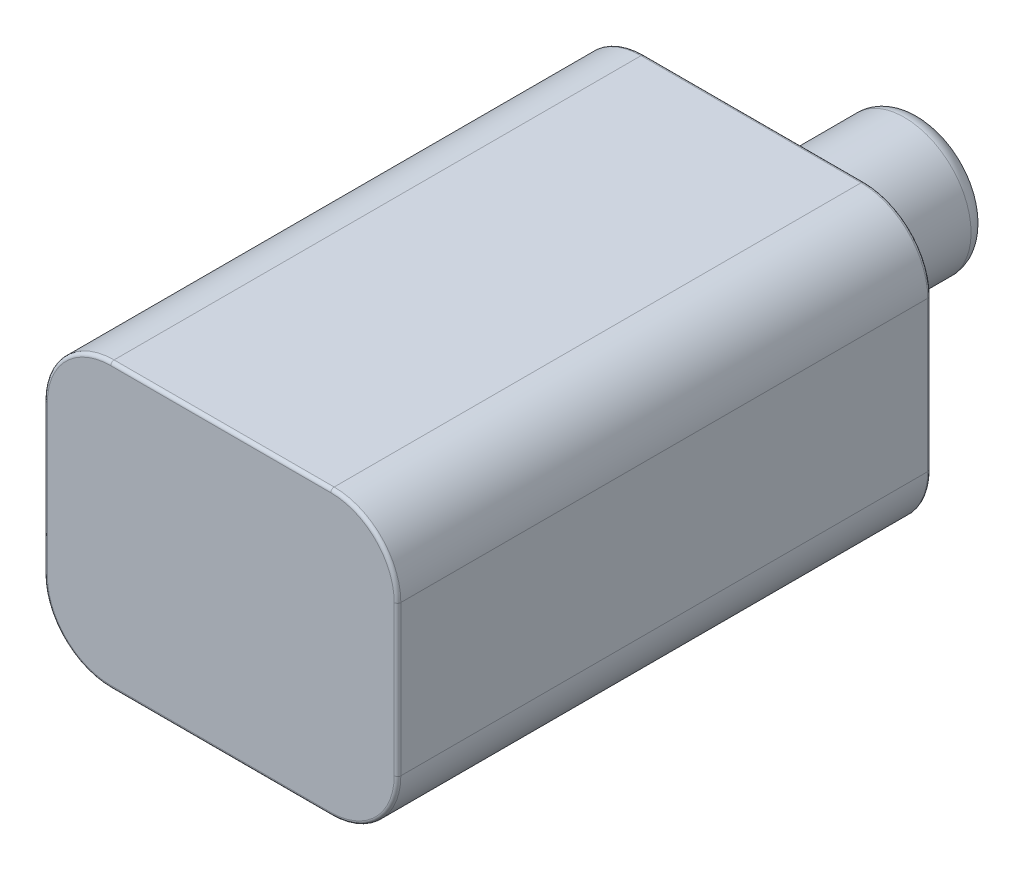
ISO-10303-21;
HEADER;
FILE_DESCRIPTION(('STEP AP214'),'2;1');
FILE_NAME('part.step','',(''),(''),'','','');
FILE_SCHEMA(('AUTOMOTIVE_DESIGN { 1 0 10303 214 1 1 1 1 }'));
ENDSEC;
DATA;
#1=APPLICATION_CONTEXT('core data for automotive mechanical design processes');
#2=APPLICATION_PROTOCOL_DEFINITION('international standard','automotive_design',2000,#1);
#3=PRODUCT_CONTEXT('',#1,'mechanical');
#4=PRODUCT('Part','Part','',(#3));
#5=PRODUCT_RELATED_PRODUCT_CATEGORY('part','',(#4));
#6=PRODUCT_DEFINITION_FORMATION('','',#4);
#7=PRODUCT_DEFINITION_CONTEXT('part definition',#1,'design');
#8=PRODUCT_DEFINITION('design','',#6,#7);
#9=PRODUCT_DEFINITION_SHAPE('','',#8);
#10=(LENGTH_UNIT() NAMED_UNIT(*) SI_UNIT(.MILLI.,.METRE.));
#11=(NAMED_UNIT(*) PLANE_ANGLE_UNIT() SI_UNIT($,.RADIAN.));
#12=(NAMED_UNIT(*) SI_UNIT($,.STERADIAN.) SOLID_ANGLE_UNIT());
#13=UNCERTAINTY_MEASURE_WITH_UNIT(LENGTH_MEASURE(1.E-05),#10,'distance_accuracy_value','');
#14=(GEOMETRIC_REPRESENTATION_CONTEXT(3) GLOBAL_UNCERTAINTY_ASSIGNED_CONTEXT((#13)) GLOBAL_UNIT_ASSIGNED_CONTEXT((#10,
#11,#12)) REPRESENTATION_CONTEXT('',''));
#15=CARTESIAN_POINT('',(0.,0.,0.));
#16=DIRECTION('',(0.,0.,1.));
#17=DIRECTION('',(1.,0.,0.));
#18=AXIS2_PLACEMENT_3D('',#15,#16,#17);
#19=CARTESIAN_POINT('',(0.,0.,-5.));
#20=DIRECTION('',(0.,0.,-1.));
#21=DIRECTION('',(-1.,0.,0.));
#22=AXIS2_PLACEMENT_3D('',#19,#20,#21);
#23=PLANE('',#22);
#24=CARTESIAN_POINT('',(0.,0.,-5.));
#25=DIRECTION('',(0.,0.,1.));
#26=DIRECTION('',(1.,0.,0.));
#27=AXIS2_PLACEMENT_3D('',#24,#25,#26);
#28=CIRCLE('',#27,1.5);
#29=CARTESIAN_POINT('',(1.5,0.,-5.));
#30=VERTEX_POINT('',#29);
#31=CARTESIAN_POINT('',(-1.5,0.,-5.));
#32=VERTEX_POINT('',#31);
#33=EDGE_CURVE('E142',#30,#32,#28,.T.);
#34=ORIENTED_EDGE('',*,*,#33,.F.);
#35=CARTESIAN_POINT('',(0.,0.,-5.));
#36=DIRECTION('',(0.,0.,1.));
#37=DIRECTION('',(-1.,0.,0.));
#38=AXIS2_PLACEMENT_3D('',#35,#36,#37);
#39=CIRCLE('',#38,1.5);
#40=EDGE_CURVE('E140',#32,#30,#39,.T.);
#41=ORIENTED_EDGE('',*,*,#40,.F.);
#42=EDGE_LOOP('',(#34,#41));
#43=FACE_BOUND('',#42,.T.);
#44=ADVANCED_FACE('F17',(#43),#23,.T.);
#45=CARTESIAN_POINT('',(0.,0.,-4.5));
#46=DIRECTION('',(0.,0.,-1.));
#47=DIRECTION('',(-1.,0.,0.));
#48=AXIS2_PLACEMENT_3D('',#45,#46,#47);
#49=TOROIDAL_SURFACE('',#48,1.5,0.5);
#50=ORIENTED_EDGE('',*,*,#40,.T.);
#51=ORIENTED_EDGE('',*,*,#33,.T.);
#52=EDGE_LOOP('',(#50,#51));
#53=FACE_BOUND('',#52,.T.);
#54=CARTESIAN_POINT('',(0.,0.,-4.5));
#55=DIRECTION('',(0.,0.,1.));
#56=DIRECTION('',(1.,0.,0.));
#57=AXIS2_PLACEMENT_3D('',#54,#55,#56);
#58=CIRCLE('',#57,2.);
#59=CARTESIAN_POINT('',(2.,0.,-4.5));
#60=VERTEX_POINT('',#59);
#61=EDGE_CURVE('E148',#60,#60,#58,.T.);
#62=ORIENTED_EDGE('',*,*,#61,.F.);
#63=EDGE_LOOP('',(#62));
#64=FACE_BOUND('',#63,.T.);
#65=ADVANCED_FACE('F144',(#53,#64),#49,.T.);
#66=CARTESIAN_POINT('',(0.,0.,-5.));
#67=DIRECTION('',(0.,0.,1.));
#68=DIRECTION('',(1.,0.,0.));
#69=AXIS2_PLACEMENT_3D('',#66,#67,#68);
#70=CYLINDRICAL_SURFACE('',#69,2.);
#71=CARTESIAN_POINT('',(0.,0.,-0.1));
#72=DIRECTION('',(0.,0.,-1.));
#73=DIRECTION('',(-1.,0.,0.));
#74=AXIS2_PLACEMENT_3D('',#71,#72,#73);
#75=CIRCLE('',#74,2.);
#76=CARTESIAN_POINT('',(-2.,0.,-0.1));
#77=VERTEX_POINT('',#76);
#78=EDGE_CURVE('E303',#77,#77,#75,.T.);
#79=ORIENTED_EDGE('',*,*,#78,.T.);
#80=EDGE_LOOP('',(#79));
#81=FACE_BOUND('',#80,.T.);
#82=ORIENTED_EDGE('',*,*,#61,.T.);
#83=EDGE_LOOP('',(#82));
#84=FACE_BOUND('',#83,.T.);
#85=ADVANCED_FACE('F174',(#81,#84),#70,.T.);
#86=CARTESIAN_POINT('',(-3.3,4.25,16.));
#87=DIRECTION('',(0.,-1.,0.));
#88=DIRECTION('',(0.,0.,-1.));
#89=AXIS2_PLACEMENT_3D('',#86,#87,#88);
#90=PLANE('',#89);
#91=DIRECTION('',(-1.,0.,0.));
#92=VECTOR('',#91,1.);
#93=CARTESIAN_POINT('',(-3.3,4.25,15.9));
#94=LINE('',#93,#92);
#95=CARTESIAN_POINT('',(3.3,4.25,15.9));
#96=VERTEX_POINT('',#95);
#97=CARTESIAN_POINT('',(-3.3,4.25,15.9));
#98=VERTEX_POINT('',#97);
#99=EDGE_CURVE('E262',#96,#98,#94,.T.);
#100=ORIENTED_EDGE('',*,*,#99,.F.);
#101=DIRECTION('',(0.,0.,-1.));
#102=VECTOR('',#101,1.);
#103=CARTESIAN_POINT('',(3.3,4.25,16.));
#104=LINE('',#103,#102);
#105=CARTESIAN_POINT('',(3.3,4.25,0.0999999999999994));
#106=VERTEX_POINT('',#105);
#107=EDGE_CURVE('E225',#106,#96,#104,.F.);
#108=ORIENTED_EDGE('',*,*,#107,.F.);
#109=DIRECTION('',(1.,0.,0.));
#110=VECTOR('',#109,1.);
#111=CARTESIAN_POINT('',(-3.3,4.25,0.0999999999999994));
#112=LINE('',#111,#110);
#113=CARTESIAN_POINT('',(-3.3,4.25,0.0999999999999994));
#114=VERTEX_POINT('',#113);
#115=EDGE_CURVE('E300',#114,#106,#112,.T.);
#116=ORIENTED_EDGE('',*,*,#115,.F.);
#117=DIRECTION('',(0.,0.,-1.));
#118=VECTOR('',#117,1.);
#119=CARTESIAN_POINT('',(-3.3,4.25,16.));
#120=LINE('',#119,#118);
#121=EDGE_CURVE('E278',#98,#114,#120,.T.);
#122=ORIENTED_EDGE('',*,*,#121,.F.);
#123=EDGE_LOOP('',(#100,#108,#116,#122));
#124=FACE_BOUND('',#123,.T.);
#125=ADVANCED_FACE('F204',(#124),#90,.F.);
#126=CARTESIAN_POINT('',(0.,0.,-0.1));
#127=DIRECTION('',(0.,0.,-1.));
#128=DIRECTION('',(-1.,0.,0.));
#129=AXIS2_PLACEMENT_3D('',#126,#127,#128);
#130=TOROIDAL_SURFACE('',#129,2.1,0.1);
#131=ORIENTED_EDGE('',*,*,#78,.F.);
#132=EDGE_LOOP('',(#131));
#133=FACE_BOUND('',#132,.T.);
#134=CARTESIAN_POINT('',(0.,0.,0.));
#135=DIRECTION('',(0.,0.,-1.));
#136=DIRECTION('',(1.,0.,0.));
#137=AXIS2_PLACEMENT_3D('',#134,#135,#136);
#138=CIRCLE('',#137,2.1);
#139=CARTESIAN_POINT('',(-2.1,0.,0.));
#140=VERTEX_POINT('',#139);
#141=CARTESIAN_POINT('',(2.1,0.,0.));
#142=VERTEX_POINT('',#141);
#143=EDGE_CURVE('E189',#140,#142,#138,.F.);
#144=ORIENTED_EDGE('',*,*,#143,.F.);
#145=CARTESIAN_POINT('',(0.,0.,0.));
#146=DIRECTION('',(0.,0.,-1.));
#147=DIRECTION('',(-1.,0.,0.));
#148=AXIS2_PLACEMENT_3D('',#145,#146,#147);
#149=CIRCLE('',#148,2.1);
#150=EDGE_CURVE('E214',#142,#140,#149,.F.);
#151=ORIENTED_EDGE('',*,*,#150,.F.);
#152=EDGE_LOOP('',(#144,#151));
#153=FACE_BOUND('',#152,.T.);
#154=ADVANCED_FACE('F193',(#133,#153),#130,.F.);
#155=CARTESIAN_POINT('',(-3.3,4.15,0.0999999999999994));
#156=DIRECTION('',(1.,0.,0.));
#157=DIRECTION('',(0.,0.,-1.));
#158=AXIS2_PLACEMENT_3D('',#155,#156,#157);
#159=CYLINDRICAL_SURFACE('',#158,0.1);
#160=CARTESIAN_POINT('',(3.3,4.15,0.0999999999999994));
#161=DIRECTION('',(1.,0.,0.));
#162=DIRECTION('',(0.,1.,0.));
#163=AXIS2_PLACEMENT_3D('',#160,#161,#162);
#164=CIRCLE('',#163,0.1);
#165=CARTESIAN_POINT('',(3.3,4.15,0.));
#166=VERTEX_POINT('',#165);
#167=EDGE_CURVE('E302',#166,#106,#164,.T.);
#168=ORIENTED_EDGE('',*,*,#167,.F.);
#169=DIRECTION('',(-1.,0.,0.));
#170=VECTOR('',#169,1.);
#171=CARTESIAN_POINT('',(-3.3,4.15,0.));
#172=LINE('',#171,#170);
#173=CARTESIAN_POINT('',(-3.3,4.15,0.));
#174=VERTEX_POINT('',#173);
#175=EDGE_CURVE('E631',#174,#166,#172,.F.);
#176=ORIENTED_EDGE('',*,*,#175,.F.);
#177=CARTESIAN_POINT('',(-3.3,4.15,0.0999999999999994));
#178=DIRECTION('',(1.,0.,0.));
#179=DIRECTION('',(0.,1.,0.));
#180=AXIS2_PLACEMENT_3D('',#177,#178,#179);
#181=CIRCLE('',#180,0.1);
#182=EDGE_CURVE('E638',#114,#174,#181,.F.);
#183=ORIENTED_EDGE('',*,*,#182,.F.);
#184=ORIENTED_EDGE('',*,*,#115,.T.);
#185=EDGE_LOOP('',(#168,#176,#183,#184));
#186=FACE_BOUND('',#185,.T.);
#187=ADVANCED_FACE('F203',(#186),#159,.T.);
#188=CARTESIAN_POINT('',(3.3,2.25,0.0999999999999994));
#189=DIRECTION('',(0.,0.,-1.));
#190=DIRECTION('',(-1.,0.,0.));
#191=AXIS2_PLACEMENT_3D('',#188,#189,#190);
#192=TOROIDAL_SURFACE('',#191,1.9,0.1);
#193=ORIENTED_EDGE('',*,*,#167,.T.);
#194=CARTESIAN_POINT('',(3.3,2.25,0.0999999999999994));
#195=DIRECTION('',(0.,0.,-1.));
#196=DIRECTION('',(-1.,0.,0.));
#197=AXIS2_PLACEMENT_3D('',#194,#195,#196);
#198=CIRCLE('',#197,2.);
#199=CARTESIAN_POINT('',(5.3,2.25,0.0999999999999994));
#200=VERTEX_POINT('',#199);
#201=EDGE_CURVE('E250',#200,#106,#198,.F.);
#202=ORIENTED_EDGE('',*,*,#201,.F.);
#203=CARTESIAN_POINT('',(5.2,2.25,0.0999999999999994));
#204=DIRECTION('',(0.,-1.,0.));
#205=DIRECTION('',(0.,0.,-1.));
#206=AXIS2_PLACEMENT_3D('',#203,#204,#205);
#207=CIRCLE('',#206,0.1);
#208=CARTESIAN_POINT('',(5.2,2.25,0.));
#209=VERTEX_POINT('',#208);
#210=EDGE_CURVE('E478',#209,#200,#207,.T.);
#211=ORIENTED_EDGE('',*,*,#210,.F.);
#212=CARTESIAN_POINT('',(3.3,2.25,0.));
#213=DIRECTION('',(0.,0.,1.));
#214=DIRECTION('',(1.,0.,0.));
#215=AXIS2_PLACEMENT_3D('',#212,#213,#214);
#216=CIRCLE('',#215,1.9);
#217=EDGE_CURVE('E580',#166,#209,#216,.F.);
#218=ORIENTED_EDGE('',*,*,#217,.F.);
#219=EDGE_LOOP('',(#193,#202,#211,#218));
#220=FACE_BOUND('',#219,.T.);
#221=ADVANCED_FACE('F640',(#220),#192,.T.);
#222=CARTESIAN_POINT('',(-3.3,2.25,0.0999999999999994));
#223=DIRECTION('',(0.,0.,-1.));
#224=DIRECTION('',(-1.,0.,0.));
#225=AXIS2_PLACEMENT_3D('',#222,#223,#224);
#226=TOROIDAL_SURFACE('',#225,1.9,0.1);
#227=ORIENTED_EDGE('',*,*,#182,.T.);
#228=CARTESIAN_POINT('',(-3.3,2.25,0.));
#229=DIRECTION('',(0.,0.,1.));
#230=DIRECTION('',(0.,1.,0.));
#231=AXIS2_PLACEMENT_3D('',#228,#229,#230);
#232=CIRCLE('',#231,1.9);
#233=CARTESIAN_POINT('',(-5.2,2.25,0.));
#234=VERTEX_POINT('',#233);
#235=EDGE_CURVE('E614',#234,#174,#232,.F.);
#236=ORIENTED_EDGE('',*,*,#235,.F.);
#237=CARTESIAN_POINT('',(-5.2,2.25,0.0999999999999994));
#238=DIRECTION('',(0.,1.,0.));
#239=DIRECTION('',(0.,0.,1.));
#240=AXIS2_PLACEMENT_3D('',#237,#238,#239);
#241=CIRCLE('',#240,0.1);
#242=CARTESIAN_POINT('',(-5.3,2.25,0.0999999999999994));
#243=VERTEX_POINT('',#242);
#244=EDGE_CURVE('E282',#243,#234,#241,.F.);
#245=ORIENTED_EDGE('',*,*,#244,.F.);
#246=CARTESIAN_POINT('',(-3.3,2.25,0.0999999999999994));
#247=DIRECTION('',(0.,0.,-1.));
#248=DIRECTION('',(-1.,0.,0.));
#249=AXIS2_PLACEMENT_3D('',#246,#247,#248);
#250=CIRCLE('',#249,2.);
#251=EDGE_CURVE('E281',#114,#243,#250,.F.);
#252=ORIENTED_EDGE('',*,*,#251,.F.);
#253=EDGE_LOOP('',(#227,#236,#245,#252));
#254=FACE_BOUND('',#253,.T.);
#255=ADVANCED_FACE('F656',(#254),#226,.T.);
#256=CARTESIAN_POINT('',(-5.2,-2.25,0.0999999999999994));
#257=DIRECTION('',(0.,1.,0.));
#258=DIRECTION('',(0.,0.,1.));
#259=AXIS2_PLACEMENT_3D('',#256,#257,#258);
#260=CYLINDRICAL_SURFACE('',#259,0.1);
#261=ORIENTED_EDGE('',*,*,#244,.T.);
#262=DIRECTION('',(0.,1.,0.));
#263=VECTOR('',#262,1.);
#264=CARTESIAN_POINT('',(-5.2,-2.25,0.));
#265=LINE('',#264,#263);
#266=CARTESIAN_POINT('',(-5.2,-2.25,0.));
#267=VERTEX_POINT('',#266);
#268=EDGE_CURVE('E619',#267,#234,#265,.T.);
#269=ORIENTED_EDGE('',*,*,#268,.F.);
#270=CARTESIAN_POINT('',(-5.2,-2.25,0.0999999999999994));
#271=DIRECTION('',(0.,1.,0.));
#272=DIRECTION('',(0.,0.,1.));
#273=AXIS2_PLACEMENT_3D('',#270,#271,#272);
#274=CIRCLE('',#273,0.1);
#275=CARTESIAN_POINT('',(-5.3,-2.25,0.0999999999999994));
#276=VERTEX_POINT('',#275);
#277=EDGE_CURVE('E679',#267,#276,#274,.T.);
#278=ORIENTED_EDGE('',*,*,#277,.T.);
#279=DIRECTION('',(0.,1.,0.));
#280=VECTOR('',#279,1.);
#281=CARTESIAN_POINT('',(-5.3,-2.25,0.0999999999999994));
#282=LINE('',#281,#280);
#283=EDGE_CURVE('E289',#276,#243,#282,.T.);
#284=ORIENTED_EDGE('',*,*,#283,.T.);
#285=EDGE_LOOP('',(#261,#269,#278,#284));
#286=FACE_BOUND('',#285,.T.);
#287=ADVANCED_FACE('F661',(#286),#260,.T.);
#288=CARTESIAN_POINT('',(-3.3,2.25,16.));
#289=DIRECTION('',(0.,0.,-1.));
#290=DIRECTION('',(-1.,0.,0.));
#291=AXIS2_PLACEMENT_3D('',#288,#289,#290);
#292=CYLINDRICAL_SURFACE('',#291,2.);
#293=ORIENTED_EDGE('',*,*,#121,.T.);
#294=ORIENTED_EDGE('',*,*,#251,.T.);
#295=DIRECTION('',(0.,0.,-1.));
#296=VECTOR('',#295,1.);
#297=CARTESIAN_POINT('',(-5.3,2.25,16.));
#298=LINE('',#297,#296);
#299=CARTESIAN_POINT('',(-5.3,2.25,15.9));
#300=VERTEX_POINT('',#299);
#301=EDGE_CURVE('E285',#243,#300,#298,.F.);
#302=ORIENTED_EDGE('',*,*,#301,.T.);
#303=CARTESIAN_POINT('',(-3.3,2.25,15.9));
#304=DIRECTION('',(0.,0.,-1.));
#305=DIRECTION('',(-1.,0.,0.));
#306=AXIS2_PLACEMENT_3D('',#303,#304,#305);
#307=CIRCLE('',#306,2.);
#308=EDGE_CURVE('E273',#98,#300,#307,.F.);
#309=ORIENTED_EDGE('',*,*,#308,.F.);
#310=EDGE_LOOP('',(#293,#294,#302,#309));
#311=FACE_BOUND('',#310,.T.);
#312=ADVANCED_FACE('F770',(#311),#292,.T.);
#313=CARTESIAN_POINT('',(-5.2,-2.25,15.9));
#314=DIRECTION('',(0.,-1.,0.));
#315=DIRECTION('',(0.,0.,-1.));
#316=AXIS2_PLACEMENT_3D('',#313,#314,#315);
#317=CYLINDRICAL_SURFACE('',#316,0.0999999999999994);
#318=CARTESIAN_POINT('',(-5.2,-2.25,15.9));
#319=DIRECTION('',(0.,1.,0.));
#320=DIRECTION('',(-1.,0.,0.));
#321=AXIS2_PLACEMENT_3D('',#318,#319,#320);
#322=CIRCLE('',#321,0.1);
#323=CARTESIAN_POINT('',(-5.2,-2.25,16.));
#324=VERTEX_POINT('',#323);
#325=CARTESIAN_POINT('',(-5.3,-2.25,15.9));
#326=VERTEX_POINT('',#325);
#327=EDGE_CURVE('E739',#324,#326,#322,.F.);
#328=ORIENTED_EDGE('',*,*,#327,.F.);
#329=DIRECTION('',(0.,1.,0.));
#330=VECTOR('',#329,1.);
#331=CARTESIAN_POINT('',(-5.2,-2.25,16.));
#332=LINE('',#331,#330);
#333=CARTESIAN_POINT('',(-5.2,2.25,16.));
#334=VERTEX_POINT('',#333);
#335=EDGE_CURVE('E717',#324,#334,#332,.T.);
#336=ORIENTED_EDGE('',*,*,#335,.T.);
#337=CARTESIAN_POINT('',(-5.2,2.25,15.9));
#338=DIRECTION('',(0.,1.,0.));
#339=DIRECTION('',(-1.,0.,0.));
#340=AXIS2_PLACEMENT_3D('',#337,#338,#339);
#341=CIRCLE('',#340,0.1);
#342=EDGE_CURVE('E275',#300,#334,#341,.T.);
#343=ORIENTED_EDGE('',*,*,#342,.F.);
#344=DIRECTION('',(0.,1.,0.));
#345=VECTOR('',#344,1.);
#346=CARTESIAN_POINT('',(-5.3,-2.25,15.9));
#347=LINE('',#346,#345);
#348=EDGE_CURVE('E288',#300,#326,#347,.F.);
#349=ORIENTED_EDGE('',*,*,#348,.T.);
#350=EDGE_LOOP('',(#328,#336,#343,#349));
#351=FACE_BOUND('',#350,.T.);
#352=ADVANCED_FACE('F518',(#351),#317,.T.);
#353=CARTESIAN_POINT('',(-3.3,2.25,15.9));
#354=DIRECTION('',(0.,0.,-1.));
#355=DIRECTION('',(-1.,0.,0.));
#356=AXIS2_PLACEMENT_3D('',#353,#354,#355);
#357=TOROIDAL_SURFACE('',#356,1.9,0.1);
#358=CARTESIAN_POINT('',(-3.3,4.15,15.9));
#359=DIRECTION('',(-1.,0.,0.));
#360=DIRECTION('',(0.,0.,1.));
#361=AXIS2_PLACEMENT_3D('',#358,#359,#360);
#362=CIRCLE('',#361,0.0999999999999994);
#363=CARTESIAN_POINT('',(-3.3,4.15,16.));
#364=VERTEX_POINT('',#363);
#365=EDGE_CURVE('E266',#98,#364,#362,.F.);
#366=ORIENTED_EDGE('',*,*,#365,.F.);
#367=ORIENTED_EDGE('',*,*,#308,.T.);
#368=ORIENTED_EDGE('',*,*,#342,.T.);
#369=CARTESIAN_POINT('',(-3.3,2.25,16.));
#370=DIRECTION('',(0.,0.,-1.));
#371=DIRECTION('',(-1.,0.,0.));
#372=AXIS2_PLACEMENT_3D('',#369,#370,#371);
#373=CIRCLE('',#372,1.9);
#374=EDGE_CURVE('E720',#334,#364,#373,.T.);
#375=ORIENTED_EDGE('',*,*,#374,.T.);
#376=EDGE_LOOP('',(#366,#367,#368,#375));
#377=FACE_BOUND('',#376,.T.);
#378=ADVANCED_FACE('F514',(#377),#357,.T.);
#379=CARTESIAN_POINT('',(-3.3,4.15,15.9));
#380=DIRECTION('',(-1.,0.,0.));
#381=DIRECTION('',(0.,0.,1.));
#382=AXIS2_PLACEMENT_3D('',#379,#380,#381);
#383=CYLINDRICAL_SURFACE('',#382,0.0999999999999994);
#384=CARTESIAN_POINT('',(3.3,4.15,15.9));
#385=DIRECTION('',(1.,0.,0.));
#386=DIRECTION('',(0.,1.,0.));
#387=AXIS2_PLACEMENT_3D('',#384,#385,#386);
#388=CIRCLE('',#387,0.1);
#389=CARTESIAN_POINT('',(3.3,4.15,16.));
#390=VERTEX_POINT('',#389);
#391=EDGE_CURVE('E265',#96,#390,#388,.T.);
#392=ORIENTED_EDGE('',*,*,#391,.F.);
#393=ORIENTED_EDGE('',*,*,#99,.T.);
#394=ORIENTED_EDGE('',*,*,#365,.T.);
#395=DIRECTION('',(-1.,0.,0.));
#396=VECTOR('',#395,1.);
#397=CARTESIAN_POINT('',(-3.3,4.15,16.));
#398=LINE('',#397,#396);
#399=EDGE_CURVE('E723',#364,#390,#398,.F.);
#400=ORIENTED_EDGE('',*,*,#399,.T.);
#401=EDGE_LOOP('',(#392,#393,#394,#400));
#402=FACE_BOUND('',#401,.T.);
#403=ADVANCED_FACE('F491',(#402),#383,.T.);
#404=CARTESIAN_POINT('',(3.3,2.25,15.9));
#405=DIRECTION('',(0.,0.,-1.));
#406=DIRECTION('',(-1.,0.,0.));
#407=AXIS2_PLACEMENT_3D('',#404,#405,#406);
#408=TOROIDAL_SURFACE('',#407,1.9,0.1);
#409=CARTESIAN_POINT('',(5.2,2.25,15.9));
#410=DIRECTION('',(0.,1.,0.));
#411=DIRECTION('',(0.,0.,1.));
#412=AXIS2_PLACEMENT_3D('',#409,#410,#411);
#413=CIRCLE('',#412,0.0999999999999994);
#414=CARTESIAN_POINT('',(5.3,2.25,15.9));
#415=VERTEX_POINT('',#414);
#416=CARTESIAN_POINT('',(5.2,2.25,16.));
#417=VERTEX_POINT('',#416);
#418=EDGE_CURVE('E253',#415,#417,#413,.F.);
#419=ORIENTED_EDGE('',*,*,#418,.F.);
#420=CARTESIAN_POINT('',(3.3,2.25,15.9));
#421=DIRECTION('',(0.,0.,-1.));
#422=DIRECTION('',(-1.,0.,0.));
#423=AXIS2_PLACEMENT_3D('',#420,#421,#422);
#424=CIRCLE('',#423,2.);
#425=EDGE_CURVE('E218',#96,#415,#424,.T.);
#426=ORIENTED_EDGE('',*,*,#425,.F.);
#427=ORIENTED_EDGE('',*,*,#391,.T.);
#428=CARTESIAN_POINT('',(3.3,2.25,16.));
#429=DIRECTION('',(0.,0.,-1.));
#430=DIRECTION('',(0.,1.,0.));
#431=AXIS2_PLACEMENT_3D('',#428,#429,#430);
#432=CIRCLE('',#431,1.9);
#433=EDGE_CURVE('E403',#390,#417,#432,.T.);
#434=ORIENTED_EDGE('',*,*,#433,.T.);
#435=EDGE_LOOP('',(#419,#426,#427,#434));
#436=FACE_BOUND('',#435,.T.);
#437=ADVANCED_FACE('F485',(#436),#408,.T.);
#438=CARTESIAN_POINT('',(5.2,-2.25,0.0999999999999994));
#439=DIRECTION('',(0.,-1.,0.));
#440=DIRECTION('',(0.,0.,-1.));
#441=AXIS2_PLACEMENT_3D('',#438,#439,#440);
#442=CYLINDRICAL_SURFACE('',#441,0.1);
#443=ORIENTED_EDGE('',*,*,#210,.T.);
#444=DIRECTION('',(0.,1.,0.));
#445=VECTOR('',#444,1.);
#446=CARTESIAN_POINT('',(5.3,-2.25,0.0999999999999994));
#447=LINE('',#446,#445);
#448=CARTESIAN_POINT('',(5.3,-2.25,0.0999999999999994));
#449=VERTEX_POINT('',#448);
#450=EDGE_CURVE('E237',#200,#449,#447,.F.);
#451=ORIENTED_EDGE('',*,*,#450,.T.);
#452=CARTESIAN_POINT('',(5.2,-2.25,0.0999999999999994));
#453=DIRECTION('',(0.,-1.,0.));
#454=DIRECTION('',(0.,0.,-1.));
#455=AXIS2_PLACEMENT_3D('',#452,#453,#454);
#456=CIRCLE('',#455,0.1);
#457=CARTESIAN_POINT('',(5.2,-2.25,0.));
#458=VERTEX_POINT('',#457);
#459=EDGE_CURVE('E504',#449,#458,#456,.F.);
#460=ORIENTED_EDGE('',*,*,#459,.T.);
#461=DIRECTION('',(0.,1.,0.));
#462=VECTOR('',#461,1.);
#463=CARTESIAN_POINT('',(5.2,-2.25,0.));
#464=LINE('',#463,#462);
#465=EDGE_CURVE('E626',#209,#458,#464,.F.);
#466=ORIENTED_EDGE('',*,*,#465,.F.);
#467=EDGE_LOOP('',(#443,#451,#460,#466));
#468=FACE_BOUND('',#467,.T.);
#469=ADVANCED_FACE('F490',(#468),#442,.T.);
#470=CARTESIAN_POINT('',(5.2,-2.25,15.9));
#471=DIRECTION('',(0.,1.,0.));
#472=DIRECTION('',(0.,0.,1.));
#473=AXIS2_PLACEMENT_3D('',#470,#471,#472);
#474=CYLINDRICAL_SURFACE('',#473,0.0999999999999994);
#475=ORIENTED_EDGE('',*,*,#418,.T.);
#476=DIRECTION('',(0.,1.,0.));
#477=VECTOR('',#476,1.);
#478=CARTESIAN_POINT('',(5.2,-2.25,16.));
#479=LINE('',#478,#477);
#480=CARTESIAN_POINT('',(5.2,-2.25,16.));
#481=VERTEX_POINT('',#480);
#482=EDGE_CURVE('E247',#417,#481,#479,.F.);
#483=ORIENTED_EDGE('',*,*,#482,.T.);
#484=CARTESIAN_POINT('',(5.2,-2.25,15.9));
#485=DIRECTION('',(0.,1.,0.));
#486=DIRECTION('',(0.,0.,1.));
#487=AXIS2_PLACEMENT_3D('',#484,#485,#486);
#488=CIRCLE('',#487,0.0999999999999994);
#489=CARTESIAN_POINT('',(5.3,-2.25,15.9));
#490=VERTEX_POINT('',#489);
#491=EDGE_CURVE('E474',#481,#490,#488,.T.);
#492=ORIENTED_EDGE('',*,*,#491,.T.);
#493=DIRECTION('',(0.,1.,0.));
#494=VECTOR('',#493,1.);
#495=CARTESIAN_POINT('',(5.3,-2.25,15.9));
#496=LINE('',#495,#494);
#497=EDGE_CURVE('E232',#490,#415,#496,.T.);
#498=ORIENTED_EDGE('',*,*,#497,.T.);
#499=EDGE_LOOP('',(#475,#483,#492,#498));
#500=FACE_BOUND('',#499,.T.);
#501=ADVANCED_FACE('F776',(#500),#474,.T.);
#502=CARTESIAN_POINT('',(3.3,2.25,16.));
#503=DIRECTION('',(0.,0.,-1.));
#504=DIRECTION('',(-1.,0.,0.));
#505=AXIS2_PLACEMENT_3D('',#502,#503,#504);
#506=CYLINDRICAL_SURFACE('',#505,2.);
#507=ORIENTED_EDGE('',*,*,#107,.T.);
#508=ORIENTED_EDGE('',*,*,#425,.T.);
#509=DIRECTION('',(0.,0.,1.));
#510=VECTOR('',#509,1.);
#511=CARTESIAN_POINT('',(5.3,2.25,16.));
#512=LINE('',#511,#510);
#513=EDGE_CURVE('E228',#415,#200,#512,.F.);
#514=ORIENTED_EDGE('',*,*,#513,.T.);
#515=ORIENTED_EDGE('',*,*,#201,.T.);
#516=EDGE_LOOP('',(#507,#508,#514,#515));
#517=FACE_BOUND('',#516,.T.);
#518=ADVANCED_FACE('F773',(#517),#506,.T.);
#519=CARTESIAN_POINT('',(-3.3,-2.25,0.));
#520=DIRECTION('',(0.,0.,-1.));
#521=DIRECTION('',(-1.,0.,0.));
#522=AXIS2_PLACEMENT_3D('',#519,#520,#521);
#523=PLANE('',#522);
#524=ORIENTED_EDGE('',*,*,#268,.T.);
#525=ORIENTED_EDGE('',*,*,#235,.T.);
#526=ORIENTED_EDGE('',*,*,#175,.T.);
#527=ORIENTED_EDGE('',*,*,#217,.T.);
#528=ORIENTED_EDGE('',*,*,#465,.T.);
#529=CARTESIAN_POINT('',(3.3,-2.25,0.));
#530=DIRECTION('',(0.,0.,1.));
#531=DIRECTION('',(0.,-1.,0.));
#532=AXIS2_PLACEMENT_3D('',#529,#530,#531);
#533=CIRCLE('',#532,1.9);
#534=CARTESIAN_POINT('',(3.3,-4.15,0.));
#535=VERTEX_POINT('',#534);
#536=EDGE_CURVE('E417',#535,#458,#533,.T.);
#537=ORIENTED_EDGE('',*,*,#536,.F.);
#538=DIRECTION('',(-1.,0.,0.));
#539=VECTOR('',#538,1.);
#540=CARTESIAN_POINT('',(-3.3,-4.15,0.));
#541=LINE('',#540,#539);
#542=CARTESIAN_POINT('',(-3.3,-4.15,0.));
#543=VERTEX_POINT('',#542);
#544=EDGE_CURVE('E424',#543,#535,#541,.F.);
#545=ORIENTED_EDGE('',*,*,#544,.F.);
#546=CARTESIAN_POINT('',(-3.3,-2.25,0.));
#547=DIRECTION('',(0.,0.,1.));
#548=DIRECTION('',(-1.,0.,0.));
#549=AXIS2_PLACEMENT_3D('',#546,#547,#548);
#550=CIRCLE('',#549,1.9);
#551=EDGE_CURVE('E602',#267,#543,#550,.T.);
#552=ORIENTED_EDGE('',*,*,#551,.F.);
#553=EDGE_LOOP('',(#524,#525,#526,#527,#528,#537,#545,#552));
#554=FACE_BOUND('',#553,.T.);
#555=ORIENTED_EDGE('',*,*,#143,.T.);
#556=ORIENTED_EDGE('',*,*,#150,.T.);
#557=EDGE_LOOP('',(#555,#556));
#558=FACE_BOUND('',#557,.T.);
#559=ADVANCED_FACE('F550',(#554,#558),#523,.T.);
#560=CARTESIAN_POINT('',(-3.3,-2.25,15.9));
#561=DIRECTION('',(0.,0.,-1.));
#562=DIRECTION('',(-1.,0.,0.));
#563=AXIS2_PLACEMENT_3D('',#560,#561,#562);
#564=TOROIDAL_SURFACE('',#563,1.9,0.1);
#565=CARTESIAN_POINT('',(-3.3,-4.15,15.9));
#566=DIRECTION('',(-1.,0.,0.));
#567=DIRECTION('',(0.,-1.,0.));
#568=AXIS2_PLACEMENT_3D('',#565,#566,#567);
#569=CIRCLE('',#568,0.1);
#570=CARTESIAN_POINT('',(-3.3,-4.25,15.9));
#571=VERTEX_POINT('',#570);
#572=CARTESIAN_POINT('',(-3.3,-4.15,16.));
#573=VERTEX_POINT('',#572);
#574=EDGE_CURVE('E297',#571,#573,#569,.T.);
#575=ORIENTED_EDGE('',*,*,#574,.T.);
#576=CARTESIAN_POINT('',(-3.3,-2.25,16.));
#577=DIRECTION('',(0.,0.,-1.));
#578=DIRECTION('',(0.,-1.,0.));
#579=AXIS2_PLACEMENT_3D('',#576,#577,#578);
#580=CIRCLE('',#579,1.9);
#581=EDGE_CURVE('E360',#573,#324,#580,.T.);
#582=ORIENTED_EDGE('',*,*,#581,.T.);
#583=ORIENTED_EDGE('',*,*,#327,.T.);
#584=CARTESIAN_POINT('',(-3.3,-2.25,15.9));
#585=DIRECTION('',(0.,0.,-1.));
#586=DIRECTION('',(-1.,0.,0.));
#587=AXIS2_PLACEMENT_3D('',#584,#585,#586);
#588=CIRCLE('',#587,2.);
#589=EDGE_CURVE('E441',#571,#326,#588,.T.);
#590=ORIENTED_EDGE('',*,*,#589,.F.);
#591=EDGE_LOOP('',(#575,#582,#583,#590));
#592=FACE_BOUND('',#591,.T.);
#593=ADVANCED_FACE('F539',(#592),#564,.T.);
#594=CARTESIAN_POINT('',(-5.3,-2.25,16.));
#595=DIRECTION('',(1.,0.,0.));
#596=DIRECTION('',(0.,0.,-1.));
#597=AXIS2_PLACEMENT_3D('',#594,#595,#596);
#598=PLANE('',#597);
#599=ORIENTED_EDGE('',*,*,#348,.F.);
#600=ORIENTED_EDGE('',*,*,#301,.F.);
#601=ORIENTED_EDGE('',*,*,#283,.F.);
#602=DIRECTION('',(0.,0.,-1.));
#603=VECTOR('',#602,1.);
#604=CARTESIAN_POINT('',(-5.3,-2.25,16.));
#605=LINE('',#604,#603);
#606=EDGE_CURVE('E447',#326,#276,#605,.T.);
#607=ORIENTED_EDGE('',*,*,#606,.F.);
#608=EDGE_LOOP('',(#599,#600,#601,#607));
#609=FACE_BOUND('',#608,.T.);
#610=ADVANCED_FACE('F549',(#609),#598,.F.);
#611=CARTESIAN_POINT('',(-3.3,-2.25,0.0999999999999994));
#612=DIRECTION('',(0.,0.,-1.));
#613=DIRECTION('',(-1.,0.,0.));
#614=AXIS2_PLACEMENT_3D('',#611,#612,#613);
#615=TOROIDAL_SURFACE('',#614,1.9,0.1);
#616=CARTESIAN_POINT('',(-3.3,-4.15,0.0999999999999994));
#617=DIRECTION('',(-1.,0.,0.));
#618=DIRECTION('',(0.,0.,1.));
#619=AXIS2_PLACEMENT_3D('',#616,#617,#618);
#620=CIRCLE('',#619,0.1);
#621=CARTESIAN_POINT('',(-3.3,-4.25,0.0999999999999994));
#622=VERTEX_POINT('',#621);
#623=EDGE_CURVE('E419',#622,#543,#620,.F.);
#624=ORIENTED_EDGE('',*,*,#623,.F.);
#625=CARTESIAN_POINT('',(-3.3,-2.25,0.0999999999999994));
#626=DIRECTION('',(0.,0.,-1.));
#627=DIRECTION('',(-1.,0.,0.));
#628=AXIS2_PLACEMENT_3D('',#625,#626,#627);
#629=CIRCLE('',#628,2.);
#630=EDGE_CURVE('E444',#276,#622,#629,.F.);
#631=ORIENTED_EDGE('',*,*,#630,.F.);
#632=ORIENTED_EDGE('',*,*,#277,.F.);
#633=ORIENTED_EDGE('',*,*,#551,.T.);
#634=EDGE_LOOP('',(#624,#631,#632,#633));
#635=FACE_BOUND('',#634,.T.);
#636=ADVANCED_FACE('F378',(#635),#615,.T.);
#637=CARTESIAN_POINT('',(-3.3,-2.25,16.));
#638=DIRECTION('',(0.,0.,-1.));
#639=DIRECTION('',(-1.,0.,0.));
#640=AXIS2_PLACEMENT_3D('',#637,#638,#639);
#641=PLANE('',#640);
#642=ORIENTED_EDGE('',*,*,#482,.F.);
#643=ORIENTED_EDGE('',*,*,#433,.F.);
#644=ORIENTED_EDGE('',*,*,#399,.F.);
#645=ORIENTED_EDGE('',*,*,#374,.F.);
#646=ORIENTED_EDGE('',*,*,#335,.F.);
#647=ORIENTED_EDGE('',*,*,#581,.F.);
#648=DIRECTION('',(1.,0.,0.));
#649=VECTOR('',#648,1.);
#650=CARTESIAN_POINT('',(-3.3,-4.15,16.));
#651=LINE('',#650,#649);
#652=CARTESIAN_POINT('',(3.3,-4.15,16.));
#653=VERTEX_POINT('',#652);
#654=EDGE_CURVE('E242',#653,#573,#651,.F.);
#655=ORIENTED_EDGE('',*,*,#654,.F.);
#656=CARTESIAN_POINT('',(3.3,-2.25,16.));
#657=DIRECTION('',(0.,0.,-1.));
#658=DIRECTION('',(1.,0.,0.));
#659=AXIS2_PLACEMENT_3D('',#656,#657,#658);
#660=CIRCLE('',#659,1.9);
#661=EDGE_CURVE('E231',#481,#653,#660,.T.);
#662=ORIENTED_EDGE('',*,*,#661,.F.);
#663=EDGE_LOOP('',(#642,#643,#644,#645,#646,#647,#655,#662));
#664=FACE_BOUND('',#663,.T.);
#665=ADVANCED_FACE('F368',(#664),#641,.F.);
#666=CARTESIAN_POINT('',(5.3,-2.25,16.));
#667=DIRECTION('',(-1.,0.,0.));
#668=DIRECTION('',(0.,0.,1.));
#669=AXIS2_PLACEMENT_3D('',#666,#667,#668);
#670=PLANE('',#669);
#671=ORIENTED_EDGE('',*,*,#497,.F.);
#672=DIRECTION('',(0.,0.,-1.));
#673=VECTOR('',#672,1.);
#674=CARTESIAN_POINT('',(5.3,-2.25,16.));
#675=LINE('',#674,#673);
#676=EDGE_CURVE('E240',#449,#490,#675,.F.);
#677=ORIENTED_EDGE('',*,*,#676,.F.);
#678=ORIENTED_EDGE('',*,*,#450,.F.);
#679=ORIENTED_EDGE('',*,*,#513,.F.);
#680=EDGE_LOOP('',(#671,#677,#678,#679));
#681=FACE_BOUND('',#680,.T.);
#682=ADVANCED_FACE('F377',(#681),#670,.F.);
#683=CARTESIAN_POINT('',(3.3,-2.25,15.9));
#684=DIRECTION('',(0.,0.,-1.));
#685=DIRECTION('',(-1.,0.,0.));
#686=AXIS2_PLACEMENT_3D('',#683,#684,#685);
#687=TOROIDAL_SURFACE('',#686,1.9,0.1);
#688=ORIENTED_EDGE('',*,*,#491,.F.);
#689=ORIENTED_EDGE('',*,*,#661,.T.);
#690=CARTESIAN_POINT('',(3.3,-4.15,15.9));
#691=DIRECTION('',(1.,0.,0.));
#692=DIRECTION('',(0.,0.,-1.));
#693=AXIS2_PLACEMENT_3D('',#690,#691,#692);
#694=CIRCLE('',#693,0.0999999999999994);
#695=CARTESIAN_POINT('',(3.3,-4.25,15.9));
#696=VERTEX_POINT('',#695);
#697=EDGE_CURVE('E446',#696,#653,#694,.F.);
#698=ORIENTED_EDGE('',*,*,#697,.F.);
#699=CARTESIAN_POINT('',(3.3,-2.25,15.9));
#700=DIRECTION('',(0.,0.,-1.));
#701=DIRECTION('',(-1.,0.,0.));
#702=AXIS2_PLACEMENT_3D('',#699,#700,#701);
#703=CIRCLE('',#702,2.);
#704=EDGE_CURVE('E36',#490,#696,#703,.T.);
#705=ORIENTED_EDGE('',*,*,#704,.F.);
#706=EDGE_LOOP('',(#688,#689,#698,#705));
#707=FACE_BOUND('',#706,.T.);
#708=ADVANCED_FACE('F345',(#707),#687,.T.);
#709=CARTESIAN_POINT('',(3.3,-2.25,0.0999999999999994));
#710=DIRECTION('',(0.,0.,-1.));
#711=DIRECTION('',(-1.,0.,0.));
#712=AXIS2_PLACEMENT_3D('',#709,#710,#711);
#713=TOROIDAL_SURFACE('',#712,1.9,0.1);
#714=ORIENTED_EDGE('',*,*,#459,.F.);
#715=CARTESIAN_POINT('',(3.3,-2.25,0.0999999999999994));
#716=DIRECTION('',(0.,0.,-1.));
#717=DIRECTION('',(-1.,0.,0.));
#718=AXIS2_PLACEMENT_3D('',#715,#716,#717);
#719=CIRCLE('',#718,2.);
#720=CARTESIAN_POINT('',(3.3,-4.25,0.0999999999999994));
#721=VERTEX_POINT('',#720);
#722=EDGE_CURVE('E256',#721,#449,#719,.F.);
#723=ORIENTED_EDGE('',*,*,#722,.F.);
#724=CARTESIAN_POINT('',(3.3,-4.15,0.0999999999999994));
#725=DIRECTION('',(-1.,0.,0.));
#726=DIRECTION('',(0.,0.,1.));
#727=AXIS2_PLACEMENT_3D('',#724,#725,#726);
#728=CIRCLE('',#727,0.1);
#729=EDGE_CURVE('E429',#535,#721,#728,.T.);
#730=ORIENTED_EDGE('',*,*,#729,.F.);
#731=ORIENTED_EDGE('',*,*,#536,.T.);
#732=EDGE_LOOP('',(#714,#723,#730,#731));
#733=FACE_BOUND('',#732,.T.);
#734=ADVANCED_FACE('F339',(#733),#713,.T.);
#735=CARTESIAN_POINT('',(-3.3,-4.15,0.0999999999999994));
#736=DIRECTION('',(-1.,0.,0.));
#737=DIRECTION('',(0.,0.,1.));
#738=AXIS2_PLACEMENT_3D('',#735,#736,#737);
#739=CYLINDRICAL_SURFACE('',#738,0.1);
#740=ORIENTED_EDGE('',*,*,#729,.T.);
#741=DIRECTION('',(1.,0.,0.));
#742=VECTOR('',#741,1.);
#743=CARTESIAN_POINT('',(-3.3,-4.25,0.0999999999999994));
#744=LINE('',#743,#742);
#745=EDGE_CURVE('E259',#721,#622,#744,.F.);
#746=ORIENTED_EDGE('',*,*,#745,.T.);
#747=ORIENTED_EDGE('',*,*,#623,.T.);
#748=ORIENTED_EDGE('',*,*,#544,.T.);
#749=EDGE_LOOP('',(#740,#746,#747,#748));
#750=FACE_BOUND('',#749,.T.);
#751=ADVANCED_FACE('F335',(#750),#739,.T.);
#752=CARTESIAN_POINT('',(-3.3,-2.25,16.));
#753=DIRECTION('',(0.,0.,-1.));
#754=DIRECTION('',(-1.,0.,0.));
#755=AXIS2_PLACEMENT_3D('',#752,#753,#754);
#756=CYLINDRICAL_SURFACE('',#755,2.);
#757=ORIENTED_EDGE('',*,*,#606,.T.);
#758=ORIENTED_EDGE('',*,*,#630,.T.);
#759=DIRECTION('',(0.,0.,1.));
#760=VECTOR('',#759,1.);
#761=CARTESIAN_POINT('',(-3.3,-4.25,16.));
#762=LINE('',#761,#760);
#763=EDGE_CURVE('E450',#622,#571,#762,.T.);
#764=ORIENTED_EDGE('',*,*,#763,.T.);
#765=ORIENTED_EDGE('',*,*,#589,.T.);
#766=EDGE_LOOP('',(#757,#758,#764,#765));
#767=FACE_BOUND('',#766,.T.);
#768=ADVANCED_FACE('F331',(#767),#756,.T.);
#769=CARTESIAN_POINT('',(-3.3,-4.15,15.9));
#770=DIRECTION('',(1.,0.,0.));
#771=DIRECTION('',(0.,0.,-1.));
#772=AXIS2_PLACEMENT_3D('',#769,#770,#771);
#773=CYLINDRICAL_SURFACE('',#772,0.0999999999999994);
#774=ORIENTED_EDGE('',*,*,#697,.T.);
#775=ORIENTED_EDGE('',*,*,#654,.T.);
#776=ORIENTED_EDGE('',*,*,#574,.F.);
#777=DIRECTION('',(1.,0.,0.));
#778=VECTOR('',#777,1.);
#779=CARTESIAN_POINT('',(-3.3,-4.25,15.9));
#780=LINE('',#779,#778);
#781=EDGE_CURVE('E28',#571,#696,#780,.T.);
#782=ORIENTED_EDGE('',*,*,#781,.T.);
#783=EDGE_LOOP('',(#774,#775,#776,#782));
#784=FACE_BOUND('',#783,.T.);
#785=ADVANCED_FACE('F325',(#784),#773,.T.);
#786=CARTESIAN_POINT('',(3.3,-2.25,16.));
#787=DIRECTION('',(0.,0.,-1.));
#788=DIRECTION('',(-1.,0.,0.));
#789=AXIS2_PLACEMENT_3D('',#786,#787,#788);
#790=CYLINDRICAL_SURFACE('',#789,2.);
#791=DIRECTION('',(0.,0.,1.));
#792=VECTOR('',#791,1.);
#793=CARTESIAN_POINT('',(3.3,-4.25,16.));
#794=LINE('',#793,#792);
#795=EDGE_CURVE('E11',#696,#721,#794,.F.);
#796=ORIENTED_EDGE('',*,*,#795,.T.);
#797=ORIENTED_EDGE('',*,*,#722,.T.);
#798=ORIENTED_EDGE('',*,*,#676,.T.);
#799=ORIENTED_EDGE('',*,*,#704,.T.);
#800=EDGE_LOOP('',(#796,#797,#798,#799));
#801=FACE_BOUND('',#800,.T.);
#802=ADVANCED_FACE('F319',(#801),#790,.T.);
#803=CARTESIAN_POINT('',(-3.3,-4.25,16.));
#804=DIRECTION('',(0.,1.,0.));
#805=DIRECTION('',(0.,0.,1.));
#806=AXIS2_PLACEMENT_3D('',#803,#804,#805);
#807=PLANE('',#806);
#808=ORIENTED_EDGE('',*,*,#781,.F.);
#809=ORIENTED_EDGE('',*,*,#763,.F.);
#810=ORIENTED_EDGE('',*,*,#745,.F.);
#811=ORIENTED_EDGE('',*,*,#795,.F.);
#812=EDGE_LOOP('',(#808,#809,#810,#811));
#813=FACE_BOUND('',#812,.T.);
#814=ADVANCED_FACE('F317',(#813),#807,.F.);
#815=CLOSED_SHELL('',(#44,#65,#85,#125,#154,#187,#221,#255,#287,#312,#352,#378,#403,#437,#469,
#501,#518,#559,#593,#610,#636,#665,#682,#708,#734,#751,#768,#785,#802,#814));
#816=MANIFOLD_SOLID_BREP('B1',#815);
#817=ADVANCED_BREP_SHAPE_REPRESENTATION('',(#18,#816),#14);
#818=SHAPE_DEFINITION_REPRESENTATION(#9,#817);
ENDSEC;
END-ISO-10303-21;
